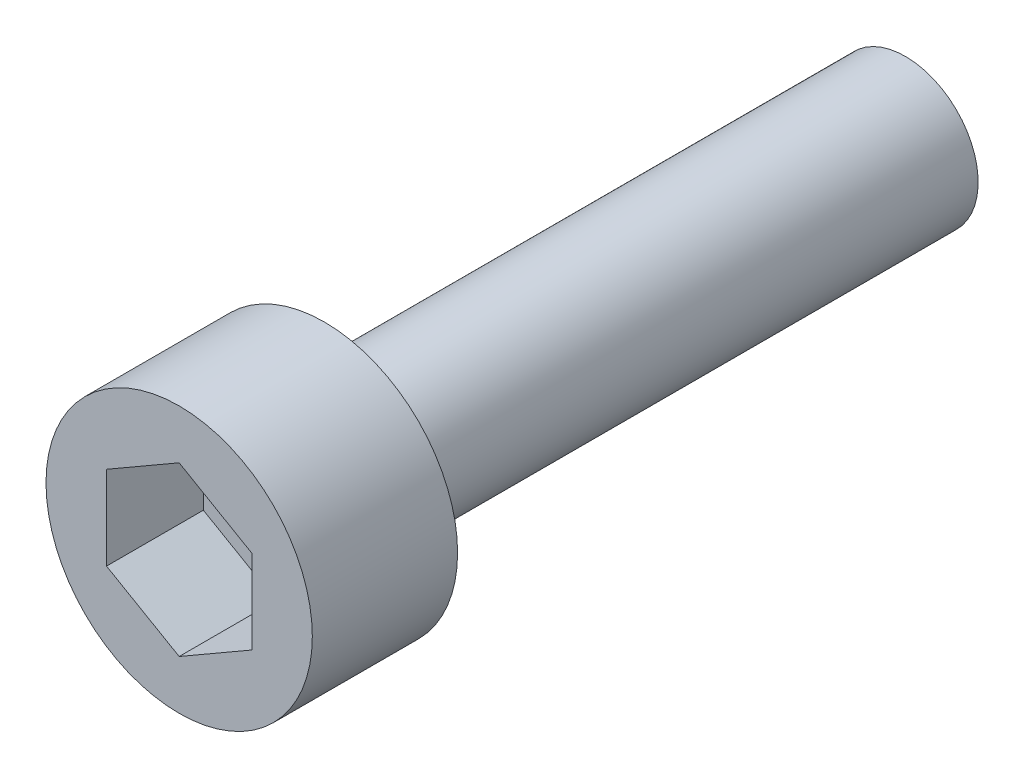
ISO-10303-21;
HEADER;
FILE_DESCRIPTION(('STEP AP214'),'2;1');
FILE_NAME('part.step','',(''),(''),'','','');
FILE_SCHEMA(('AUTOMOTIVE_DESIGN { 1 0 10303 214 1 1 1 1 }'));
ENDSEC;
DATA;
#1=APPLICATION_CONTEXT('core data for automotive mechanical design processes');
#2=APPLICATION_PROTOCOL_DEFINITION('international standard','automotive_design',2000,#1);
#3=PRODUCT_CONTEXT('',#1,'mechanical');
#4=PRODUCT('Part','Part','',(#3));
#5=PRODUCT_RELATED_PRODUCT_CATEGORY('part','',(#4));
#6=PRODUCT_DEFINITION_FORMATION('','',#4);
#7=PRODUCT_DEFINITION_CONTEXT('part definition',#1,'design');
#8=PRODUCT_DEFINITION('design','',#6,#7);
#9=PRODUCT_DEFINITION_SHAPE('','',#8);
#10=(LENGTH_UNIT() NAMED_UNIT(*) SI_UNIT(.MILLI.,.METRE.));
#11=(NAMED_UNIT(*) PLANE_ANGLE_UNIT() SI_UNIT($,.RADIAN.));
#12=(NAMED_UNIT(*) SI_UNIT($,.STERADIAN.) SOLID_ANGLE_UNIT());
#13=UNCERTAINTY_MEASURE_WITH_UNIT(LENGTH_MEASURE(1.E-05),#10,'distance_accuracy_value','');
#14=(GEOMETRIC_REPRESENTATION_CONTEXT(3) GLOBAL_UNCERTAINTY_ASSIGNED_CONTEXT((#13)) GLOBAL_UNIT_ASSIGNED_CONTEXT((#10,
#11,#12)) REPRESENTATION_CONTEXT('',''));
#15=CARTESIAN_POINT('',(0.,0.,0.));
#16=DIRECTION('',(0.,0.,1.));
#17=DIRECTION('',(1.,0.,0.));
#18=AXIS2_PLACEMENT_3D('',#15,#16,#17);
#19=CARTESIAN_POINT('',(-150.000000000004,409.256441958458,-353.357743681071));
#20=DIRECTION('',(-0.499999999999959,0.866025403784462,0.));
#21=DIRECTION('',(-0.866025403784462,-0.499999999999959,0.));
#22=AXIS2_PLACEMENT_3D('',#19,#20,#21);
#23=PLANE('',#22);
#24=DIRECTION('',(0.,0.,1.));
#25=VECTOR('',#24,1.);
#26=CARTESIAN_POINT('',(-150.000000000004,409.256441958458,-353.357743681071));
#27=LINE('',#26,#25);
#28=CARTESIAN_POINT('',(-150.000000000004,409.256441958458,-355.357743681071));
#29=VERTEX_POINT('',#28);
#30=CARTESIAN_POINT('',(-150.000000000004,409.256441958458,-353.357743681071));
#31=VERTEX_POINT('',#30);
#32=EDGE_CURVE('E82',#29,#31,#27,.T.);
#33=ORIENTED_EDGE('',*,*,#32,.T.);
#34=DIRECTION('',(-0.866025403784462,-0.499999999999959,0.));
#35=VECTOR('',#34,1.);
#36=CARTESIAN_POINT('',(-150.000000000004,409.256441958458,-353.357743681071));
#37=LINE('',#36,#35);
#38=CARTESIAN_POINT('',(-151.500000000004,408.390416554673,-353.357743681072));
#39=VERTEX_POINT('',#38);
#40=EDGE_CURVE('E71',#39,#31,#37,.F.);
#41=ORIENTED_EDGE('',*,*,#40,.F.);
#42=DIRECTION('',(0.,0.,1.));
#43=VECTOR('',#42,1.);
#44=CARTESIAN_POINT('',(-151.500000000004,408.390416554673,-353.357743681071));
#45=LINE('',#44,#43);
#46=CARTESIAN_POINT('',(-151.500000000004,408.390416554673,-355.357743681071));
#47=VERTEX_POINT('',#46);
#48=EDGE_CURVE('E127',#39,#47,#45,.F.);
#49=ORIENTED_EDGE('',*,*,#48,.T.);
#50=DIRECTION('',(-0.866025403784462,-0.499999999999959,0.));
#51=VECTOR('',#50,1.);
#52=CARTESIAN_POINT('',(-150.000000000004,409.256441958458,-355.357743681071));
#53=LINE('',#52,#51);
#54=EDGE_CURVE('E67',#29,#47,#53,.T.);
#55=ORIENTED_EDGE('',*,*,#54,.F.);
#56=EDGE_LOOP('',(#33,#41,#49,#55));
#57=FACE_BOUND('',#56,.T.);
#58=ADVANCED_FACE('F17',(#57),#23,.F.);
#59=CARTESIAN_POINT('',(-148.500000000004,408.390416554674,-353.357743681071));
#60=DIRECTION('',(0.5,0.866025403784439,0.));
#61=DIRECTION('',(-0.866025403784439,0.5,0.));
#62=AXIS2_PLACEMENT_3D('',#59,#60,#61);
#63=PLANE('',#62);
#64=DIRECTION('',(0.,0.,-1.));
#65=VECTOR('',#64,1.);
#66=CARTESIAN_POINT('',(-148.500000000004,408.390416554674,-353.357743681071));
#67=LINE('',#66,#65);
#68=CARTESIAN_POINT('',(-148.500000000004,408.390416554674,-355.357743681071));
#69=VERTEX_POINT('',#68);
#70=CARTESIAN_POINT('',(-148.500000000004,408.390416554674,-353.357743681071));
#71=VERTEX_POINT('',#70);
#72=EDGE_CURVE('E87',#69,#71,#67,.F.);
#73=ORIENTED_EDGE('',*,*,#72,.T.);
#74=DIRECTION('',(-0.866025403784439,0.5,0.));
#75=VECTOR('',#74,1.);
#76=CARTESIAN_POINT('',(-148.500000000004,408.390416554674,-353.357743681071));
#77=LINE('',#76,#75);
#78=EDGE_CURVE('E75',#31,#71,#77,.F.);
#79=ORIENTED_EDGE('',*,*,#78,.F.);
#80=ORIENTED_EDGE('',*,*,#32,.F.);
#81=DIRECTION('',(-0.866025403784439,0.5,0.));
#82=VECTOR('',#81,1.);
#83=CARTESIAN_POINT('',(-148.500000000004,408.390416554674,-355.357743681071));
#84=LINE('',#83,#82);
#85=EDGE_CURVE('E88',#69,#29,#84,.T.);
#86=ORIENTED_EDGE('',*,*,#85,.F.);
#87=EDGE_LOOP('',(#73,#79,#80,#86));
#88=FACE_BOUND('',#87,.T.);
#89=ADVANCED_FACE('F85',(#88),#63,.F.);
#90=CARTESIAN_POINT('',(-151.500000000004,408.390416554673,-353.357743681071));
#91=DIRECTION('',(-1.,0.,0.));
#92=DIRECTION('',(0.,0.,1.));
#93=AXIS2_PLACEMENT_3D('',#90,#91,#92);
#94=PLANE('',#93);
#95=ORIENTED_EDGE('',*,*,#48,.F.);
#96=DIRECTION('',(0.,1.,0.));
#97=VECTOR('',#96,1.);
#98=CARTESIAN_POINT('',(-151.500000000004,408.390416554673,-353.357743681071));
#99=LINE('',#98,#97);
#100=CARTESIAN_POINT('',(-151.500000000004,406.658365747105,-353.357743681072));
#101=VERTEX_POINT('',#100);
#102=EDGE_CURVE('E78',#101,#39,#99,.T.);
#103=ORIENTED_EDGE('',*,*,#102,.F.);
#104=DIRECTION('',(0.,0.,1.));
#105=VECTOR('',#104,1.);
#106=CARTESIAN_POINT('',(-151.500000000004,406.658365747105,-353.357743681071));
#107=LINE('',#106,#105);
#108=CARTESIAN_POINT('',(-151.500000000004,406.658365747105,-355.357743681071));
#109=VERTEX_POINT('',#108);
#110=EDGE_CURVE('E118',#101,#109,#107,.F.);
#111=ORIENTED_EDGE('',*,*,#110,.T.);
#112=DIRECTION('',(0.,1.,0.));
#113=VECTOR('',#112,1.);
#114=CARTESIAN_POINT('',(-151.500000000004,408.390416554673,-355.357743681071));
#115=LINE('',#114,#113);
#116=EDGE_CURVE('E125',#47,#109,#115,.F.);
#117=ORIENTED_EDGE('',*,*,#116,.F.);
#118=EDGE_LOOP('',(#95,#103,#111,#117));
#119=FACE_BOUND('',#118,.T.);
#120=ADVANCED_FACE('F130',(#119),#94,.F.);
#121=CARTESIAN_POINT('',(-148.500000000004,406.658365747105,-353.357743681071));
#122=DIRECTION('',(1.,0.,0.));
#123=DIRECTION('',(0.,0.,-1.));
#124=AXIS2_PLACEMENT_3D('',#121,#122,#123);
#125=PLANE('',#124);
#126=DIRECTION('',(0.,0.,1.));
#127=VECTOR('',#126,1.);
#128=CARTESIAN_POINT('',(-148.500000000004,406.658365747105,-353.357743681071));
#129=LINE('',#128,#127);
#130=CARTESIAN_POINT('',(-148.500000000004,406.658365747105,-355.357743681071));
#131=VERTEX_POINT('',#130);
#132=CARTESIAN_POINT('',(-148.500000000004,406.658365747105,-353.357743681071));
#133=VERTEX_POINT('',#132);
#134=EDGE_CURVE('E111',#131,#133,#129,.T.);
#135=ORIENTED_EDGE('',*,*,#134,.T.);
#136=DIRECTION('',(0.,1.,0.));
#137=VECTOR('',#136,1.);
#138=CARTESIAN_POINT('',(-148.500000000004,406.658365747105,-353.357743681071));
#139=LINE('',#138,#137);
#140=EDGE_CURVE('E35',#71,#133,#139,.F.);
#141=ORIENTED_EDGE('',*,*,#140,.F.);
#142=ORIENTED_EDGE('',*,*,#72,.F.);
#143=DIRECTION('',(0.,1.,0.));
#144=VECTOR('',#143,1.);
#145=CARTESIAN_POINT('',(-148.500000000004,407.524391150889,-355.357743681071));
#146=LINE('',#145,#144);
#147=EDGE_CURVE('E116',#69,#131,#146,.F.);
#148=ORIENTED_EDGE('',*,*,#147,.T.);
#149=EDGE_LOOP('',(#135,#141,#142,#148));
#150=FACE_BOUND('',#149,.T.);
#151=ADVANCED_FACE('F138',(#150),#125,.F.);
#152=CARTESIAN_POINT('',(-151.500000000004,406.658365747105,-353.357743681071));
#153=DIRECTION('',(-0.5,-0.866025403784439,0.));
#154=DIRECTION('',(0.866025403784439,-0.5,0.));
#155=AXIS2_PLACEMENT_3D('',#152,#153,#154);
#156=PLANE('',#155);
#157=ORIENTED_EDGE('',*,*,#110,.F.);
#158=DIRECTION('',(0.866025403784439,-0.5,0.));
#159=VECTOR('',#158,1.);
#160=CARTESIAN_POINT('',(-151.500000000004,406.658365747105,-353.357743681071));
#161=LINE('',#160,#159);
#162=CARTESIAN_POINT('',(-150.000000000004,405.79234034332,-353.357743681071));
#163=VERTEX_POINT('',#162);
#164=EDGE_CURVE('E121',#163,#101,#161,.F.);
#165=ORIENTED_EDGE('',*,*,#164,.F.);
#166=DIRECTION('',(0.,0.,1.));
#167=VECTOR('',#166,1.);
#168=CARTESIAN_POINT('',(-150.000000000004,405.79234034332,-353.357743681071));
#169=LINE('',#168,#167);
#170=CARTESIAN_POINT('',(-150.000000000004,405.79234034332,-355.357743681071));
#171=VERTEX_POINT('',#170);
#172=EDGE_CURVE('E107',#163,#171,#169,.F.);
#173=ORIENTED_EDGE('',*,*,#172,.T.);
#174=DIRECTION('',(-0.866025403784299,0.500000000000242,0.));
#175=VECTOR('',#174,1.);
#176=CARTESIAN_POINT('',(-150.000000000004,405.79234034332,-355.357743681071));
#177=LINE('',#176,#175);
#178=EDGE_CURVE('E113',#171,#109,#177,.T.);
#179=ORIENTED_EDGE('',*,*,#178,.T.);
#180=EDGE_LOOP('',(#157,#165,#173,#179));
#181=FACE_BOUND('',#180,.T.);
#182=ADVANCED_FACE('F144',(#181),#156,.F.);
#183=CARTESIAN_POINT('',(-150.000000000004,407.524391150889,-355.357743681071));
#184=DIRECTION('',(0.,0.,-1.));
#185=DIRECTION('',(-1.,0.,0.));
#186=AXIS2_PLACEMENT_3D('',#183,#184,#185);
#187=PLANE('',#186);
#188=DIRECTION('',(0.866025403784434,0.500000000000008,0.));
#189=VECTOR('',#188,1.);
#190=CARTESIAN_POINT('',(-150.000000000004,405.79234034332,-355.357743681071));
#191=LINE('',#190,#189);
#192=EDGE_CURVE('E103',#171,#131,#191,.T.);
#193=ORIENTED_EDGE('',*,*,#192,.T.);
#194=ORIENTED_EDGE('',*,*,#147,.F.);
#195=ORIENTED_EDGE('',*,*,#85,.T.);
#196=ORIENTED_EDGE('',*,*,#54,.T.);
#197=ORIENTED_EDGE('',*,*,#116,.T.);
#198=ORIENTED_EDGE('',*,*,#178,.F.);
#199=EDGE_LOOP('',(#193,#194,#195,#196,#197,#198));
#200=FACE_BOUND('',#199,.T.);
#201=ADVANCED_FACE('F134',(#200),#187,.F.);
#202=CARTESIAN_POINT('',(-150.000000000004,405.79234034332,-353.357743681071));
#203=DIRECTION('',(0.500000000000008,-0.866025403784434,0.));
#204=DIRECTION('',(0.866025403784434,0.500000000000008,0.));
#205=AXIS2_PLACEMENT_3D('',#202,#203,#204);
#206=PLANE('',#205);
#207=ORIENTED_EDGE('',*,*,#172,.F.);
#208=DIRECTION('',(-0.866025403784299,-0.500000000000242,0.));
#209=VECTOR('',#208,1.);
#210=CARTESIAN_POINT('',(-148.500000000004,406.658365747105,-353.357743681072));
#211=LINE('',#210,#209);
#212=EDGE_CURVE('E100',#133,#163,#211,.T.);
#213=ORIENTED_EDGE('',*,*,#212,.F.);
#214=ORIENTED_EDGE('',*,*,#134,.F.);
#215=ORIENTED_EDGE('',*,*,#192,.F.);
#216=EDGE_LOOP('',(#207,#213,#214,#215));
#217=FACE_BOUND('',#216,.T.);
#218=ADVANCED_FACE('F142',(#217),#206,.F.);
#219=CARTESIAN_POINT('',(-150.000000000003,407.52439115089,-353.357743681072));
#220=DIRECTION('',(0.,0.,1.));
#221=DIRECTION('',(1.,0.,0.));
#222=AXIS2_PLACEMENT_3D('',#219,#220,#221);
#223=PLANE('',#222);
#224=ORIENTED_EDGE('',*,*,#140,.T.);
#225=ORIENTED_EDGE('',*,*,#212,.T.);
#226=ORIENTED_EDGE('',*,*,#164,.T.);
#227=ORIENTED_EDGE('',*,*,#102,.T.);
#228=ORIENTED_EDGE('',*,*,#40,.T.);
#229=ORIENTED_EDGE('',*,*,#78,.T.);
#230=EDGE_LOOP('',(#224,#225,#226,#227,#228,#229));
#231=FACE_BOUND('',#230,.T.);
#232=CARTESIAN_POINT('',(-150.000000000003,407.52439115089,-353.357743681072));
#233=DIRECTION('',(0.,0.,-1.));
#234=DIRECTION('',(-1.,0.,0.));
#235=AXIS2_PLACEMENT_3D('',#232,#233,#234);
#236=CIRCLE('',#235,2.75);
#237=CARTESIAN_POINT('',(-152.750000000003,407.52439115089,-353.357743681072));
#238=VERTEX_POINT('',#237);
#239=EDGE_CURVE('E20',#238,#238,#236,.T.);
#240=ORIENTED_EDGE('',*,*,#239,.F.);
#241=EDGE_LOOP('',(#240));
#242=FACE_BOUND('',#241,.T.);
#243=ADVANCED_FACE('F72',(#231,#242),#223,.T.);
#244=CARTESIAN_POINT('',(-150.000000000003,407.52439115089,-354.857743681072));
#245=DIRECTION('',(0.,0.,-1.));
#246=DIRECTION('',(-1.,0.,0.));
#247=AXIS2_PLACEMENT_3D('',#244,#245,#246);
#248=CYLINDRICAL_SURFACE('',#247,2.75);
#249=CARTESIAN_POINT('',(-150.000000000003,407.52439115089,-356.357743681072));
#250=DIRECTION('',(0.,0.,-1.));
#251=DIRECTION('',(-1.,0.,0.));
#252=AXIS2_PLACEMENT_3D('',#249,#250,#251);
#253=CIRCLE('',#252,2.75);
#254=CARTESIAN_POINT('',(-152.750000000003,407.52439115089,-356.357743681072));
#255=VERTEX_POINT('',#254);
#256=EDGE_CURVE('E95',#255,#255,#253,.T.);
#257=ORIENTED_EDGE('',*,*,#256,.F.);
#258=EDGE_LOOP('',(#257));
#259=FACE_BOUND('',#258,.T.);
#260=ORIENTED_EDGE('',*,*,#239,.T.);
#261=EDGE_LOOP('',(#260));
#262=FACE_BOUND('',#261,.T.);
#263=ADVANCED_FACE('F169',(#259,#262),#248,.T.);
#264=CARTESIAN_POINT('',(-150.000000000003,407.52439115089,-356.357743681072));
#265=DIRECTION('',(0.,0.,-1.));
#266=DIRECTION('',(-1.,0.,0.));
#267=AXIS2_PLACEMENT_3D('',#264,#265,#266);
#268=PLANE('',#267);
#269=CARTESIAN_POINT('',(-150.000000000003,407.52439115089,-356.357743681072));
#270=DIRECTION('',(0.,0.,-1.));
#271=DIRECTION('',(-1.,0.,0.));
#272=AXIS2_PLACEMENT_3D('',#269,#270,#271);
#273=CIRCLE('',#272,1.5);
#274=CARTESIAN_POINT('',(-151.500000000003,407.52439115089,-356.357743681072));
#275=VERTEX_POINT('',#274);
#276=EDGE_CURVE('E26',#275,#275,#273,.T.);
#277=ORIENTED_EDGE('',*,*,#276,.F.);
#278=EDGE_LOOP('',(#277));
#279=FACE_BOUND('',#278,.T.);
#280=ORIENTED_EDGE('',*,*,#256,.T.);
#281=EDGE_LOOP('',(#280));
#282=FACE_BOUND('',#281,.T.);
#283=ADVANCED_FACE('F162',(#279,#282),#268,.T.);
#284=CARTESIAN_POINT('',(-150.000000000003,407.52439115089,-368.357743681072));
#285=DIRECTION('',(0.,0.,-1.));
#286=DIRECTION('',(-1.,0.,0.));
#287=AXIS2_PLACEMENT_3D('',#284,#285,#286);
#288=PLANE('',#287);
#289=CARTESIAN_POINT('',(-150.000000000003,407.52439115089,-368.357743681072));
#290=DIRECTION('',(0.,0.,-1.));
#291=DIRECTION('',(-1.,0.,0.));
#292=AXIS2_PLACEMENT_3D('',#289,#290,#291);
#293=CIRCLE('',#292,1.5);
#294=CARTESIAN_POINT('',(-151.500000000003,407.52439115089,-368.357743681072));
#295=VERTEX_POINT('',#294);
#296=EDGE_CURVE('E11',#295,#295,#293,.F.);
#297=ORIENTED_EDGE('',*,*,#296,.F.);
#298=EDGE_LOOP('',(#297));
#299=FACE_BOUND('',#298,.T.);
#300=ADVANCED_FACE('F156',(#299),#288,.T.);
#301=CARTESIAN_POINT('',(-150.000000000003,407.52439115089,-359.357743681072));
#302=DIRECTION('',(0.,0.,-1.));
#303=DIRECTION('',(-1.,0.,0.));
#304=AXIS2_PLACEMENT_3D('',#301,#302,#303);
#305=CYLINDRICAL_SURFACE('',#304,1.5);
#306=ORIENTED_EDGE('',*,*,#276,.T.);
#307=EDGE_LOOP('',(#306));
#308=FACE_BOUND('',#307,.T.);
#309=ORIENTED_EDGE('',*,*,#296,.T.);
#310=EDGE_LOOP('',(#309));
#311=FACE_BOUND('',#310,.T.);
#312=ADVANCED_FACE('F154',(#308,#311),#305,.T.);
#313=CLOSED_SHELL('',(#58,#89,#120,#151,#182,#201,#218,#243,#263,#283,#300,#312));
#314=MANIFOLD_SOLID_BREP('B1',#313);
#315=ADVANCED_BREP_SHAPE_REPRESENTATION('',(#18,#314),#14);
#316=SHAPE_DEFINITION_REPRESENTATION(#9,#315);
ENDSEC;
END-ISO-10303-21;
